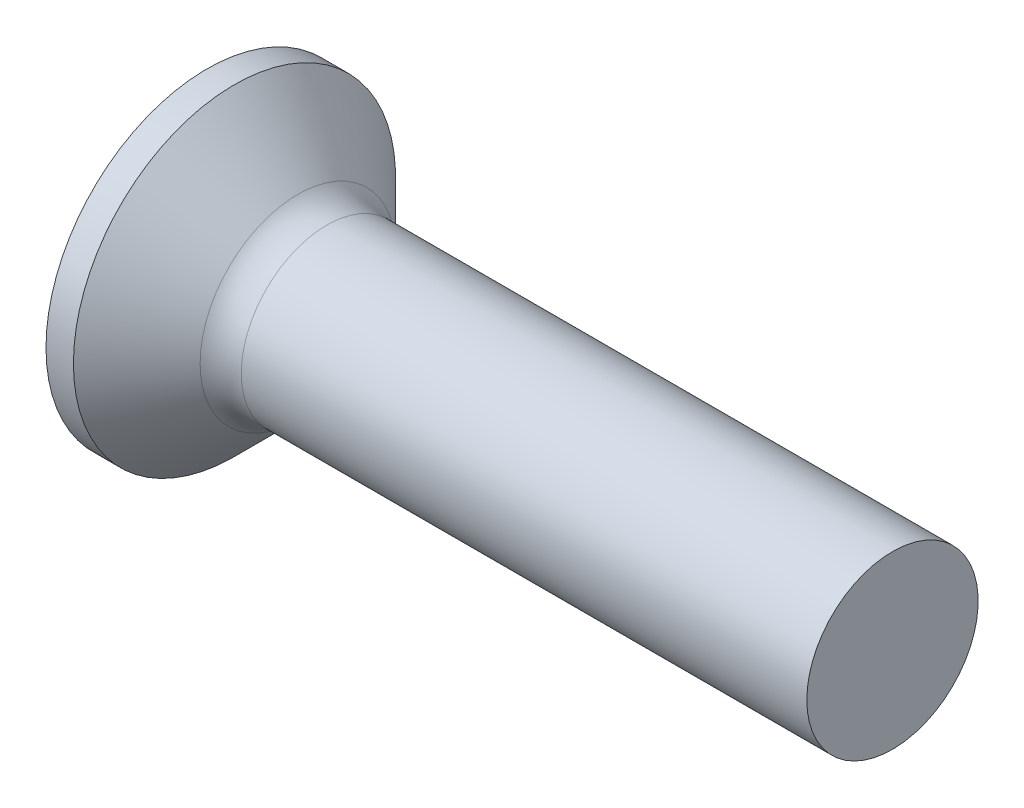
ISO-10303-21;
HEADER;
FILE_DESCRIPTION(('STEP AP214'),'2;1');
FILE_NAME('part.step','',(''),(''),'','','');
FILE_SCHEMA(('AUTOMOTIVE_DESIGN { 1 0 10303 214 1 1 1 1 }'));
ENDSEC;
DATA;
#1=APPLICATION_CONTEXT('core data for automotive mechanical design processes');
#2=APPLICATION_PROTOCOL_DEFINITION('international standard','automotive_design',2000,#1);
#3=PRODUCT_CONTEXT('',#1,'mechanical');
#4=PRODUCT('Part','Part','',(#3));
#5=PRODUCT_RELATED_PRODUCT_CATEGORY('part','',(#4));
#6=PRODUCT_DEFINITION_FORMATION('','',#4);
#7=PRODUCT_DEFINITION_CONTEXT('part definition',#1,'design');
#8=PRODUCT_DEFINITION('design','',#6,#7);
#9=PRODUCT_DEFINITION_SHAPE('','',#8);
#10=(LENGTH_UNIT() NAMED_UNIT(*) SI_UNIT(.MILLI.,.METRE.));
#11=(NAMED_UNIT(*) PLANE_ANGLE_UNIT() SI_UNIT($,.RADIAN.));
#12=(NAMED_UNIT(*) SI_UNIT($,.STERADIAN.) SOLID_ANGLE_UNIT());
#13=UNCERTAINTY_MEASURE_WITH_UNIT(LENGTH_MEASURE(1.E-05),#10,'distance_accuracy_value','');
#14=(GEOMETRIC_REPRESENTATION_CONTEXT(3) GLOBAL_UNCERTAINTY_ASSIGNED_CONTEXT((#13)) GLOBAL_UNIT_ASSIGNED_CONTEXT((#10,
#11,#12)) REPRESENTATION_CONTEXT('',''));
#15=CARTESIAN_POINT('',(0.,0.,0.));
#16=DIRECTION('',(0.,0.,1.));
#17=DIRECTION('',(1.,0.,0.));
#18=AXIS2_PLACEMENT_3D('',#15,#16,#17);
#19=CARTESIAN_POINT('',(1.73,0.370000000000002,-0.537453962312428));
#20=DIRECTION('',(-0.446197753347436,0.,0.894934391398443));
#21=DIRECTION('',(0.894934391398443,0.,0.446197753347436));
#22=AXIS2_PLACEMENT_3D('',#19,#20,#21);
#23=PLANE('',#22);
#24=DIRECTION('',(0.,1.,0.));
#25=VECTOR('',#24,1.);
#26=CARTESIAN_POINT('',(0.,0.370000000000002,-1.4));
#27=LINE('',#26,#25);
#28=CARTESIAN_POINT('',(0.,0.370000000000005,-1.4));
#29=VERTEX_POINT('',#28);
#30=CARTESIAN_POINT('',(0.,-0.369999999999995,-1.4));
#31=VERTEX_POINT('',#30);
#32=EDGE_CURVE('E175',#29,#31,#27,.F.);
#33=ORIENTED_EDGE('',*,*,#32,.T.);
#34=DIRECTION('',(-0.894934391398442,0.,-0.446197753347436));
#35=VECTOR('',#34,1.);
#36=CARTESIAN_POINT('',(1.73,-0.369999999999998,-0.53745396231243));
#37=LINE('',#36,#35);
#38=CARTESIAN_POINT('',(1.73,-0.369999999999997,-0.53745396231243));
#39=VERTEX_POINT('',#38);
#40=EDGE_CURVE('E203',#39,#31,#37,.T.);
#41=ORIENTED_EDGE('',*,*,#40,.F.);
#42=DIRECTION('',(0.,1.,0.));
#43=VECTOR('',#42,1.);
#44=CARTESIAN_POINT('',(1.73,0.370000000000002,-0.537453962312428));
#45=LINE('',#44,#43);
#46=CARTESIAN_POINT('',(1.73000000000012,-0.142405190905221,-0.53745396231243));
#47=VERTEX_POINT('',#46);
#48=EDGE_CURVE('E186',#39,#47,#45,.T.);
#49=ORIENTED_EDGE('',*,*,#48,.T.);
#50=CARTESIAN_POINT('',(2.67005399171405,0.,-0.0687604098469165));
#51=DIRECTION('',(-0.446197753347436,0.,0.894934391398443));
#52=DIRECTION('',(-0.894934391398443,0.,-0.446197753347436));
#53=AXIS2_PLACEMENT_3D('',#50,#51,#52);
#54=ELLIPSE('',#53,1.09876174310879,0.485419197280464);
#55=CARTESIAN_POINT('',(1.73000000000012,0.142405190905225,-0.537453962312429));
#56=VERTEX_POINT('',#55);
#57=EDGE_CURVE('E20',#47,#56,#54,.F.);
#58=ORIENTED_EDGE('',*,*,#57,.T.);
#59=DIRECTION('',(0.,1.,0.));
#60=VECTOR('',#59,1.);
#61=CARTESIAN_POINT('',(1.73,0.370000000000002,-0.537453962312428));
#62=LINE('',#61,#60);
#63=CARTESIAN_POINT('',(1.73,0.370000000000002,-0.537453962312428));
#64=VERTEX_POINT('',#63);
#65=EDGE_CURVE('E167',#56,#64,#62,.T.);
#66=ORIENTED_EDGE('',*,*,#65,.T.);
#67=DIRECTION('',(0.894934391398442,0.,0.446197753347436));
#68=VECTOR('',#67,1.);
#69=CARTESIAN_POINT('',(0.,0.370000000000005,-1.4));
#70=LINE('',#69,#68);
#71=EDGE_CURVE('E193',#29,#64,#70,.T.);
#72=ORIENTED_EDGE('',*,*,#71,.F.);
#73=EDGE_LOOP('',(#33,#41,#49,#58,#66,#72));
#74=FACE_BOUND('',#73,.T.);
#75=ADVANCED_FACE('F17',(#74),#23,.T.);
#76=CARTESIAN_POINT('',(1.73,-0.369999999999998,-0.53745396231243));
#77=DIRECTION('',(0.,1.,0.));
#78=DIRECTION('',(0.,0.,1.));
#79=AXIS2_PLACEMENT_3D('',#76,#77,#78);
#80=PLANE('',#79);
#81=DIRECTION('',(0.,0.,1.));
#82=VECTOR('',#81,1.);
#83=CARTESIAN_POINT('',(1.73,-0.369999999999998,-0.53745396231243));
#84=LINE('',#83,#82);
#85=CARTESIAN_POINT('',(1.73000000000467,-0.369999999999999,-0.415013252802522));
#86=VERTEX_POINT('',#85);
#87=EDGE_CURVE('E206',#86,#39,#84,.F.);
#88=ORIENTED_EDGE('',*,*,#87,.T.);
#89=ORIENTED_EDGE('',*,*,#40,.T.);
#90=DIRECTION('',(0.,0.,1.));
#91=VECTOR('',#90,1.);
#92=CARTESIAN_POINT('',(0.,-0.369999999999998,-0.53745396231243));
#93=LINE('',#92,#91);
#94=CARTESIAN_POINT('',(0.,-0.369999999999998,-0.566915305449494));
#95=VERTEX_POINT('',#94);
#96=EDGE_CURVE('E200',#31,#95,#93,.T.);
#97=ORIENTED_EDGE('',*,*,#96,.T.);
#98=CARTESIAN_POINT('',(6.21743637794065E-13,-0.369999999999998,-0.566915305449442));
#99=CARTESIAN_POINT('',(0.210211798222308,-0.369999999999998,-0.549344413477696));
#100=CARTESIAN_POINT('',(0.420407070778332,-0.369999999999998,-0.531564435264664));
#101=CARTESIAN_POINT('',(0.840738581503893,-0.369999999999998,-0.495346236705765));
#102=CARTESIAN_POINT('',(1.05087482026154,-0.369999999999998,-0.476908023170024));
#103=CARTESIAN_POINT('',(1.33915479955478,-0.369999999999998,-0.450991756825283));
#104=CARTESIAN_POINT('',(1.41733328845287,-0.369999999999999,-0.443900811028888));
#105=CARTESIAN_POINT('',(1.57367713350504,-0.369999999999999,-0.429572412876348));
#106=CARTESIAN_POINT('',(1.65184248960782,-0.369999999999999,-0.422334959960801));
#107=CARTESIAN_POINT('',(1.73000000000345,-0.369999999999999,-0.415013252805209));
#108=B_SPLINE_CURVE_WITH_KNOTS('',3,(#98,#99,#100,#101,#102,#103,#104,#105,#106,#107),
.UNSPECIFIED.,.F.,.F.,(4,2,2,2,4),(0.,0.632836027840334,1.26566551023325,1.50116361514128,
1.7366626194105),.UNSPECIFIED.);
#109=EDGE_CURVE('E446',#95,#86,#108,.T.);
#110=ORIENTED_EDGE('',*,*,#109,.T.);
#111=EDGE_LOOP('',(#88,#89,#97,#110));
#112=FACE_BOUND('',#111,.T.);
#113=ADVANCED_FACE('F464',(#112),#80,.T.);
#114=CARTESIAN_POINT('',(1.73,0.369999999999998,0.537453962312431));
#115=DIRECTION('',(0.,-1.,0.));
#116=DIRECTION('',(0.,0.,-1.));
#117=AXIS2_PLACEMENT_3D('',#114,#115,#116);
#118=PLANE('',#117);
#119=DIRECTION('',(0.,0.,-1.));
#120=VECTOR('',#119,1.);
#121=CARTESIAN_POINT('',(0.,0.369999999999998,0.537453962312431));
#122=LINE('',#121,#120);
#123=CARTESIAN_POINT('',(3.10872028908155E-13,0.370000000000002,-0.566915305449466));
#124=VERTEX_POINT('',#123);
#125=EDGE_CURVE('E196',#124,#29,#122,.T.);
#126=ORIENTED_EDGE('',*,*,#125,.T.);
#127=ORIENTED_EDGE('',*,*,#71,.T.);
#128=DIRECTION('',(0.,0.,-1.));
#129=VECTOR('',#128,1.);
#130=CARTESIAN_POINT('',(1.73,0.369999999999998,0.537453962312431));
#131=LINE('',#130,#129);
#132=CARTESIAN_POINT('',(1.73000000000456,0.370000000001036,-0.415013252804107));
#133=VERTEX_POINT('',#132);
#134=EDGE_CURVE('E171',#64,#133,#131,.F.);
#135=ORIENTED_EDGE('',*,*,#134,.T.);
#136=CARTESIAN_POINT('',(1.73000000000344,0.370000000000001,-0.415013252805134));
#137=CARTESIAN_POINT('',(1.55750312966305,0.370000000000001,-0.431158403070762));
#138=CARTESIAN_POINT('',(1.38497096483335,0.370000000000001,-0.446919624114488));
#139=CARTESIAN_POINT('',(1.039853381613,0.370000000000002,-0.477835186705177));
#140=CARTESIAN_POINT('',(0.867267963599816,0.370000000000002,-0.492989532458456));
#141=CARTESIAN_POINT('',(0.578901935102292,0.370000000000002,-0.517935214761391));
#142=CARTESIAN_POINT('',(0.463131863674144,0.370000000000002,-0.527849157298766));
#143=CARTESIAN_POINT('',(0.231576539327062,0.370000000000002,-0.547504590063611));
#144=CARTESIAN_POINT('',(0.115791286340796,0.370000000000002,-0.557246079498231));
#145=CARTESIAN_POINT('',(6.24094619879966E-13,0.370000000000002,-0.566915305449465));
#146=B_SPLINE_CURVE_WITH_KNOTS('',3,(#136,#137,#138,#139,#140,#141,#142,#143,#144,#145),
.UNSPECIFIED.,.F.,.F.,(4,2,2,2,4),(0.,0.519751041956632,1.03949848084184,1.38807974306463,
1.73666260746872),.UNSPECIFIED.);
#147=EDGE_CURVE('E443',#133,#124,#146,.T.);
#148=ORIENTED_EDGE('',*,*,#147,.T.);
#149=EDGE_LOOP('',(#126,#127,#135,#148));
#150=FACE_BOUND('',#149,.T.);
#151=ADVANCED_FACE('F487',(#150),#118,.T.);
#152=CARTESIAN_POINT('',(0.,0.,0.));
#153=DIRECTION('',(-1.,0.,0.));
#154=DIRECTION('',(0.,0.,1.));
#155=AXIS2_PLACEMENT_3D('',#152,#153,#154);
#156=CONICAL_SURFACE('',#155,0.676973384670987,0.0698131700826303);
#157=ORIENTED_EDGE('',*,*,#109,.F.);
#158=CARTESIAN_POINT('',(0.,0.,0.));
#159=DIRECTION('',(-1.,0.,0.));
#160=DIRECTION('',(0.,0.,1.));
#161=AXIS2_PLACEMENT_3D('',#158,#159,#160);
#162=CIRCLE('',#161,0.676973384670987);
#163=CARTESIAN_POINT('',(0.,-0.566915305449493,-0.37));
#164=VERTEX_POINT('',#163);
#165=EDGE_CURVE('E195',#164,#95,#162,.F.);
#166=ORIENTED_EDGE('',*,*,#165,.F.);
#167=CARTESIAN_POINT('',(1.73000000000197,-0.415013252805273,-0.37));
#168=CARTESIAN_POINT('',(1.55750312966155,-0.431158403070902,-0.37));
#169=CARTESIAN_POINT('',(1.38497096483182,-0.446919624114628,-0.37));
#170=CARTESIAN_POINT('',(1.0398533816114,-0.47783518670532,-0.37));
#171=CARTESIAN_POINT('',(0.867267963598186,-0.4929895324586,-0.37));
#172=CARTESIAN_POINT('',(0.578901935100927,-0.517935214761509,-0.37));
#173=CARTESIAN_POINT('',(0.463131863673077,-0.527849157298858,-0.37));
#174=CARTESIAN_POINT('',(0.231576539326589,-0.547504590063652,-0.37));
#175=CARTESIAN_POINT('',(0.115791286340619,-0.557246079498247,-0.37));
#176=CARTESIAN_POINT('',(7.45202362593051E-13,-0.566915305449457,-0.37));
#177=B_SPLINE_CURVE_WITH_KNOTS('',3,(#167,#168,#169,#170,#171,#172,#173,#174,#175,#176),
.UNSPECIFIED.,.F.,.F.,(4,2,2,2,4),(0.,0.519751041956728,1.03949848084203,1.38807974306393,
1.73666260746712),.UNSPECIFIED.);
#178=CARTESIAN_POINT('',(1.73000000000467,-0.415013252802521,-0.37));
#179=VERTEX_POINT('',#178);
#180=EDGE_CURVE('E433',#179,#164,#177,.T.);
#181=ORIENTED_EDGE('',*,*,#180,.F.);
#182=CARTESIAN_POINT('',(1.73000000000911,0.,0.));
#183=DIRECTION('',(-1.,0.,0.));
#184=DIRECTION('',(0.,0.,1.));
#185=AXIS2_PLACEMENT_3D('',#182,#183,#184);
#186=CIRCLE('',#185,0.55600000000311);
#187=EDGE_CURVE('E444',#86,#179,#186,.T.);
#188=ORIENTED_EDGE('',*,*,#187,.F.);
#189=EDGE_LOOP('',(#157,#166,#181,#188));
#190=FACE_BOUND('',#189,.T.);
#191=ADVANCED_FACE('F467',(#190),#156,.F.);
#192=CARTESIAN_POINT('',(0.,0.,0.));
#193=DIRECTION('',(-1.,0.,0.));
#194=DIRECTION('',(0.,0.,1.));
#195=AXIS2_PLACEMENT_3D('',#192,#193,#194);
#196=CONICAL_SURFACE('',#195,0.676973384670987,0.0698131700826303);
#197=ORIENTED_EDGE('',*,*,#147,.F.);
#198=CARTESIAN_POINT('',(1.73000000000911,0.,0.));
#199=DIRECTION('',(-1.,0.,0.));
#200=DIRECTION('',(0.,0.,1.));
#201=AXIS2_PLACEMENT_3D('',#198,#199,#200);
#202=CIRCLE('',#201,0.55600000000311);
#203=CARTESIAN_POINT('',(1.73000000000456,0.415013252804108,-0.370000000001035));
#204=VERTEX_POINT('',#203);
#205=EDGE_CURVE('E179',#204,#133,#202,.T.);
#206=ORIENTED_EDGE('',*,*,#205,.F.);
#207=CARTESIAN_POINT('',(7.42964703682483E-13,0.566915305449431,-0.37));
#208=CARTESIAN_POINT('',(0.210211798222427,0.549344413477684,-0.37));
#209=CARTESIAN_POINT('',(0.420407070778448,0.531564435264652,-0.37));
#210=CARTESIAN_POINT('',(0.840738581504004,0.495346236705754,-0.37));
#211=CARTESIAN_POINT('',(1.05087482026165,0.476908023170013,-0.37));
#212=CARTESIAN_POINT('',(1.33915479955462,0.450991756825296,-0.37));
#213=CARTESIAN_POINT('',(1.41733328845245,0.443900811028925,-0.37));
#214=CARTESIAN_POINT('',(1.5736771335041,0.429572412876434,-0.37));
#215=CARTESIAN_POINT('',(1.65184248960662,0.422334959960912,-0.37));
#216=CARTESIAN_POINT('',(1.73000000000198,0.415013252805345,-0.37));
#217=B_SPLINE_CURVE_WITH_KNOTS('',3,(#207,#208,#209,#210,#211,#212,#213,#214,#215,#216),
.UNSPECIFIED.,.F.,.F.,(4,2,2,2,4),(0.,0.632836027840326,1.26566551023323,1.50116361514048,
1.7366626194089),.UNSPECIFIED.);
#218=CARTESIAN_POINT('',(3.71481800429003E-13,0.566915305449462,-0.37));
#219=VERTEX_POINT('',#218);
#220=EDGE_CURVE('E423',#219,#204,#217,.T.);
#221=ORIENTED_EDGE('',*,*,#220,.F.);
#222=CARTESIAN_POINT('',(0.,0.,0.));
#223=DIRECTION('',(-1.,0.,0.));
#224=DIRECTION('',(0.,0.,1.));
#225=AXIS2_PLACEMENT_3D('',#222,#223,#224);
#226=CIRCLE('',#225,0.676973384670987);
#227=EDGE_CURVE('E439',#124,#219,#226,.F.);
#228=ORIENTED_EDGE('',*,*,#227,.F.);
#229=EDGE_LOOP('',(#197,#206,#221,#228));
#230=FACE_BOUND('',#229,.T.);
#231=ADVANCED_FACE('F494',(#230),#196,.F.);
#232=CARTESIAN_POINT('',(1.73,0.537453962312429,-0.37));
#233=DIRECTION('',(0.,0.,1.));
#234=DIRECTION('',(1.,0.,0.));
#235=AXIS2_PLACEMENT_3D('',#232,#233,#234);
#236=PLANE('',#235);
#237=DIRECTION('',(0.,1.,0.));
#238=VECTOR('',#237,1.);
#239=CARTESIAN_POINT('',(0.,0.537453962312429,-0.37));
#240=LINE('',#239,#238);
#241=CARTESIAN_POINT('',(0.,-1.4,-0.37));
#242=VERTEX_POINT('',#241);
#243=EDGE_CURVE('E429',#164,#242,#240,.F.);
#244=ORIENTED_EDGE('',*,*,#243,.T.);
#245=DIRECTION('',(-0.894934391398443,-0.446197753347436,0.));
#246=VECTOR('',#245,1.);
#247=CARTESIAN_POINT('',(1.73,-0.537453962312429,-0.37));
#248=LINE('',#247,#246);
#249=CARTESIAN_POINT('',(1.73,-0.537453962312429,-0.37));
#250=VERTEX_POINT('',#249);
#251=EDGE_CURVE('E410',#250,#242,#248,.T.);
#252=ORIENTED_EDGE('',*,*,#251,.F.);
#253=DIRECTION('',(0.,1.,0.));
#254=VECTOR('',#253,1.);
#255=CARTESIAN_POINT('',(1.73,0.537453962312429,-0.37));
#256=LINE('',#255,#254);
#257=EDGE_CURVE('E436',#250,#179,#256,.T.);
#258=ORIENTED_EDGE('',*,*,#257,.T.);
#259=ORIENTED_EDGE('',*,*,#180,.T.);
#260=EDGE_LOOP('',(#244,#252,#258,#259));
#261=FACE_BOUND('',#260,.T.);
#262=ADVANCED_FACE('F539',(#261),#236,.T.);
#263=CARTESIAN_POINT('',(1.73,0.537453962312429,-0.37));
#264=DIRECTION('',(0.,0.,1.));
#265=DIRECTION('',(1.,0.,0.));
#266=AXIS2_PLACEMENT_3D('',#263,#264,#265);
#267=PLANE('',#266);
#268=DIRECTION('',(0.,1.,0.));
#269=VECTOR('',#268,1.);
#270=CARTESIAN_POINT('',(1.73,0.537453962312429,-0.37));
#271=LINE('',#270,#269);
#272=CARTESIAN_POINT('',(1.73,0.53745396231243,-0.37));
#273=VERTEX_POINT('',#272);
#274=EDGE_CURVE('E415',#204,#273,#271,.T.);
#275=ORIENTED_EDGE('',*,*,#274,.T.);
#276=DIRECTION('',(0.894934391398443,-0.446197753347436,0.));
#277=VECTOR('',#276,1.);
#278=CARTESIAN_POINT('',(1.73,0.537453962312429,-0.37));
#279=LINE('',#278,#277);
#280=CARTESIAN_POINT('',(0.,1.4,-0.37));
#281=VERTEX_POINT('',#280);
#282=EDGE_CURVE('E391',#281,#273,#279,.T.);
#283=ORIENTED_EDGE('',*,*,#282,.F.);
#284=DIRECTION('',(0.,1.,0.));
#285=VECTOR('',#284,1.);
#286=CARTESIAN_POINT('',(0.,0.537453962312429,-0.37));
#287=LINE('',#286,#285);
#288=EDGE_CURVE('E426',#281,#219,#287,.F.);
#289=ORIENTED_EDGE('',*,*,#288,.T.);
#290=ORIENTED_EDGE('',*,*,#220,.T.);
#291=EDGE_LOOP('',(#275,#283,#289,#290));
#292=FACE_BOUND('',#291,.T.);
#293=ADVANCED_FACE('F534',(#292),#267,.T.);
#294=CARTESIAN_POINT('',(1.73,-0.537453962312429,-0.37));
#295=DIRECTION('',(-0.446197753347436,0.894934391398443,0.));
#296=DIRECTION('',(-0.894934391398443,-0.446197753347436,0.));
#297=AXIS2_PLACEMENT_3D('',#294,#295,#296);
#298=PLANE('',#297);
#299=DIRECTION('',(0.,0.,1.));
#300=VECTOR('',#299,1.);
#301=CARTESIAN_POINT('',(0.,-1.4,-0.37));
#302=LINE('',#301,#300);
#303=CARTESIAN_POINT('',(0.,-1.4,0.37));
#304=VERTEX_POINT('',#303);
#305=EDGE_CURVE('E401',#242,#304,#302,.T.);
#306=ORIENTED_EDGE('',*,*,#305,.T.);
#307=DIRECTION('',(-0.894934391398442,-0.446197753347436,0.));
#308=VECTOR('',#307,1.);
#309=CARTESIAN_POINT('',(1.73,-0.537453962312429,0.37));
#310=LINE('',#309,#308);
#311=CARTESIAN_POINT('',(1.73,-0.537453962312429,0.37));
#312=VERTEX_POINT('',#311);
#313=EDGE_CURVE('E351',#312,#304,#310,.T.);
#314=ORIENTED_EDGE('',*,*,#313,.F.);
#315=DIRECTION('',(0.,0.,-1.));
#316=VECTOR('',#315,1.);
#317=CARTESIAN_POINT('',(1.73,-0.537453962312429,-0.37));
#318=LINE('',#317,#316);
#319=CARTESIAN_POINT('',(1.73000000000012,-0.53745396231243,0.142405190905223));
#320=VERTEX_POINT('',#319);
#321=EDGE_CURVE('E376',#312,#320,#318,.T.);
#322=ORIENTED_EDGE('',*,*,#321,.T.);
#323=CARTESIAN_POINT('',(2.67005399171405,-0.0687604098469165,0.));
#324=DIRECTION('',(-0.446197753347436,0.894934391398443,0.));
#325=DIRECTION('',(-0.894934391398443,-0.446197753347436,0.));
#326=AXIS2_PLACEMENT_3D('',#323,#324,#325);
#327=ELLIPSE('',#326,1.09876174310879,0.485419197280464);
#328=CARTESIAN_POINT('',(1.73000000000012,-0.53745396231243,-0.142405190905223));
#329=VERTEX_POINT('',#328);
#330=EDGE_CURVE('E368',#320,#329,#327,.F.);
#331=ORIENTED_EDGE('',*,*,#330,.T.);
#332=DIRECTION('',(0.,0.,-1.));
#333=VECTOR('',#332,1.);
#334=CARTESIAN_POINT('',(1.73,-0.537453962312429,-0.37));
#335=LINE('',#334,#333);
#336=EDGE_CURVE('E361',#329,#250,#335,.T.);
#337=ORIENTED_EDGE('',*,*,#336,.T.);
#338=ORIENTED_EDGE('',*,*,#251,.T.);
#339=EDGE_LOOP('',(#306,#314,#322,#331,#337,#338));
#340=FACE_BOUND('',#339,.T.);
#341=ADVANCED_FACE('F538',(#340),#298,.T.);
#342=CARTESIAN_POINT('',(1.73,0.537453962312429,0.37));
#343=DIRECTION('',(-0.446197753347436,-0.894934391398443,0.));
#344=DIRECTION('',(0.894934391398443,-0.446197753347436,0.));
#345=AXIS2_PLACEMENT_3D('',#342,#343,#344);
#346=PLANE('',#345);
#347=DIRECTION('',(0.,0.,1.));
#348=VECTOR('',#347,1.);
#349=CARTESIAN_POINT('',(0.,1.4,0.37));
#350=LINE('',#349,#348);
#351=CARTESIAN_POINT('',(0.,1.4,0.37));
#352=VERTEX_POINT('',#351);
#353=EDGE_CURVE('E398',#352,#281,#350,.F.);
#354=ORIENTED_EDGE('',*,*,#353,.T.);
#355=ORIENTED_EDGE('',*,*,#282,.T.);
#356=DIRECTION('',(0.,0.,-1.));
#357=VECTOR('',#356,1.);
#358=CARTESIAN_POINT('',(1.73,0.53745396231243,-0.37));
#359=LINE('',#358,#357);
#360=CARTESIAN_POINT('',(1.73000000000012,0.53745396231243,-0.142405190905221));
#361=VERTEX_POINT('',#360);
#362=EDGE_CURVE('E389',#273,#361,#359,.F.);
#363=ORIENTED_EDGE('',*,*,#362,.T.);
#364=CARTESIAN_POINT('',(2.67005399171405,0.0687604098469164,0.));
#365=DIRECTION('',(-0.446197753347436,-0.894934391398443,0.));
#366=DIRECTION('',(-0.894934391398443,0.446197753347436,0.));
#367=AXIS2_PLACEMENT_3D('',#364,#365,#366);
#368=ELLIPSE('',#367,1.09876174310879,0.485419197280464);
#369=CARTESIAN_POINT('',(1.73000000000012,0.53745396231243,0.142405190905221));
#370=VERTEX_POINT('',#369);
#371=EDGE_CURVE('E382',#361,#370,#368,.F.);
#372=ORIENTED_EDGE('',*,*,#371,.T.);
#373=DIRECTION('',(0.,0.,-1.));
#374=VECTOR('',#373,1.);
#375=CARTESIAN_POINT('',(1.73,0.53745396231243,-0.37));
#376=LINE('',#375,#374);
#377=CARTESIAN_POINT('',(1.73,0.53745396231243,0.37));
#378=VERTEX_POINT('',#377);
#379=EDGE_CURVE('E378',#370,#378,#376,.F.);
#380=ORIENTED_EDGE('',*,*,#379,.T.);
#381=DIRECTION('',(0.894934391398443,-0.446197753347436,0.));
#382=VECTOR('',#381,1.);
#383=CARTESIAN_POINT('',(0.,1.4,0.37));
#384=LINE('',#383,#382);
#385=EDGE_CURVE('E181',#352,#378,#384,.T.);
#386=ORIENTED_EDGE('',*,*,#385,.F.);
#387=EDGE_LOOP('',(#354,#355,#363,#372,#380,#386));
#388=FACE_BOUND('',#387,.T.);
#389=ADVANCED_FACE('F590',(#388),#346,.T.);
#390=CARTESIAN_POINT('',(1.73,0.537453962312429,-0.37));
#391=DIRECTION('',(1.,0.,0.));
#392=DIRECTION('',(0.,0.,-1.));
#393=AXIS2_PLACEMENT_3D('',#390,#391,#392);
#394=PLANE('',#393);
#395=ORIENTED_EDGE('',*,*,#134,.F.);
#396=ORIENTED_EDGE('',*,*,#65,.F.);
#397=CARTESIAN_POINT('',(1.73000000000023,0.,0.));
#398=DIRECTION('',(-1.,0.,0.));
#399=DIRECTION('',(0.,-1.,0.));
#400=AXIS2_PLACEMENT_3D('',#397,#398,#399);
#401=CIRCLE('',#400,0.556000000000001);
#402=EDGE_CURVE('E169',#56,#133,#401,.F.);
#403=ORIENTED_EDGE('',*,*,#402,.T.);
#404=EDGE_LOOP('',(#395,#396,#403));
#405=FACE_BOUND('',#404,.T.);
#406=ADVANCED_FACE('F168',(#405),#394,.F.);
#407=CARTESIAN_POINT('',(1.73,0.537453962312429,-0.37));
#408=DIRECTION('',(1.,0.,0.));
#409=DIRECTION('',(0.,0.,-1.));
#410=AXIS2_PLACEMENT_3D('',#407,#408,#409);
#411=PLANE('',#410);
#412=ORIENTED_EDGE('',*,*,#362,.F.);
#413=ORIENTED_EDGE('',*,*,#274,.F.);
#414=CARTESIAN_POINT('',(1.73000000000023,0.,0.));
#415=DIRECTION('',(-1.,0.,0.));
#416=DIRECTION('',(0.,-1.,0.));
#417=AXIS2_PLACEMENT_3D('',#414,#415,#416);
#418=CIRCLE('',#417,0.556000000000001);
#419=EDGE_CURVE('E180',#204,#361,#418,.F.);
#420=ORIENTED_EDGE('',*,*,#419,.T.);
#421=EDGE_LOOP('',(#412,#413,#420));
#422=FACE_BOUND('',#421,.T.);
#423=ADVANCED_FACE('F584',(#422),#411,.F.);
#424=CARTESIAN_POINT('',(1.68695256780893,0.,0.));
#425=DIRECTION('',(-1.,0.,0.));
#426=DIRECTION('',(0.,0.,1.));
#427=AXIS2_PLACEMENT_3D('',#424,#425,#426);
#428=CONICAL_SURFACE('',#427,0.55901016970239,0.0698131701529839);
#429=ORIENTED_EDGE('',*,*,#371,.F.);
#430=CARTESIAN_POINT('',(1.73000000000023,0.,0.));
#431=DIRECTION('',(-1.,0.,0.));
#432=DIRECTION('',(0.,0.,1.));
#433=AXIS2_PLACEMENT_3D('',#430,#431,#432);
#434=CIRCLE('',#433,0.556000000000001);
#435=EDGE_CURVE('E385',#361,#370,#434,.F.);
#436=ORIENTED_EDGE('',*,*,#435,.T.);
#437=EDGE_LOOP('',(#429,#436));
#438=FACE_BOUND('',#437,.T.);
#439=ADVANCED_FACE('F580',(#438),#428,.F.);
#440=CARTESIAN_POINT('',(1.73,0.537453962312429,-0.37));
#441=DIRECTION('',(1.,0.,0.));
#442=DIRECTION('',(0.,0.,-1.));
#443=AXIS2_PLACEMENT_3D('',#440,#441,#442);
#444=PLANE('',#443);
#445=DIRECTION('',(0.,1.,0.));
#446=VECTOR('',#445,1.);
#447=CARTESIAN_POINT('',(1.73,-0.537453962312429,0.37));
#448=LINE('',#447,#446);
#449=CARTESIAN_POINT('',(1.73000000000467,0.415013252802521,0.370000000000001));
#450=VERTEX_POINT('',#449);
#451=EDGE_CURVE('E346',#378,#450,#448,.F.);
#452=ORIENTED_EDGE('',*,*,#451,.F.);
#453=ORIENTED_EDGE('',*,*,#379,.F.);
#454=CARTESIAN_POINT('',(1.73000000000023,0.,0.));
#455=DIRECTION('',(-1.,0.,0.));
#456=DIRECTION('',(0.,-1.,0.));
#457=AXIS2_PLACEMENT_3D('',#454,#455,#456);
#458=CIRCLE('',#457,0.556000000000001);
#459=EDGE_CURVE('E388',#370,#450,#458,.F.);
#460=ORIENTED_EDGE('',*,*,#459,.T.);
#461=EDGE_LOOP('',(#452,#453,#460));
#462=FACE_BOUND('',#461,.T.);
#463=ADVANCED_FACE('F573',(#462),#444,.F.);
#464=CARTESIAN_POINT('',(1.73,0.537453962312429,-0.37));
#465=DIRECTION('',(1.,0.,0.));
#466=DIRECTION('',(0.,0.,-1.));
#467=AXIS2_PLACEMENT_3D('',#464,#465,#466);
#468=PLANE('',#467);
#469=ORIENTED_EDGE('',*,*,#321,.F.);
#470=DIRECTION('',(0.,1.,0.));
#471=VECTOR('',#470,1.);
#472=CARTESIAN_POINT('',(1.73,-0.537453962312429,0.37));
#473=LINE('',#472,#471);
#474=CARTESIAN_POINT('',(1.73000000000467,-0.415013252802521,0.370000000000001));
#475=VERTEX_POINT('',#474);
#476=EDGE_CURVE('E354',#475,#312,#473,.F.);
#477=ORIENTED_EDGE('',*,*,#476,.F.);
#478=CARTESIAN_POINT('',(1.73000000000023,0.,0.));
#479=DIRECTION('',(-1.,0.,0.));
#480=DIRECTION('',(0.,-1.,0.));
#481=AXIS2_PLACEMENT_3D('',#478,#479,#480);
#482=CIRCLE('',#481,0.556000000000001);
#483=EDGE_CURVE('E375',#475,#320,#482,.F.);
#484=ORIENTED_EDGE('',*,*,#483,.T.);
#485=EDGE_LOOP('',(#469,#477,#484));
#486=FACE_BOUND('',#485,.T.);
#487=ADVANCED_FACE('F566',(#486),#468,.F.);
#488=CARTESIAN_POINT('',(1.68695256780893,0.,0.));
#489=DIRECTION('',(-1.,0.,0.));
#490=DIRECTION('',(0.,0.,1.));
#491=AXIS2_PLACEMENT_3D('',#488,#489,#490);
#492=CONICAL_SURFACE('',#491,0.55901016970239,0.0698131701529839);
#493=ORIENTED_EDGE('',*,*,#330,.F.);
#494=CARTESIAN_POINT('',(1.73000000000023,0.,0.));
#495=DIRECTION('',(-1.,0.,0.));
#496=DIRECTION('',(0.,0.,1.));
#497=AXIS2_PLACEMENT_3D('',#494,#495,#496);
#498=CIRCLE('',#497,0.556000000000001);
#499=EDGE_CURVE('E371',#320,#329,#498,.F.);
#500=ORIENTED_EDGE('',*,*,#499,.T.);
#501=EDGE_LOOP('',(#493,#500));
#502=FACE_BOUND('',#501,.T.);
#503=ADVANCED_FACE('F564',(#502),#492,.F.);
#504=CARTESIAN_POINT('',(1.73,0.537453962312429,-0.37));
#505=DIRECTION('',(1.,0.,0.));
#506=DIRECTION('',(0.,0.,-1.));
#507=AXIS2_PLACEMENT_3D('',#504,#505,#506);
#508=PLANE('',#507);
#509=ORIENTED_EDGE('',*,*,#257,.F.);
#510=ORIENTED_EDGE('',*,*,#336,.F.);
#511=CARTESIAN_POINT('',(1.73000000000023,0.,0.));
#512=DIRECTION('',(-1.,0.,0.));
#513=DIRECTION('',(0.,-1.,0.));
#514=AXIS2_PLACEMENT_3D('',#511,#512,#513);
#515=CIRCLE('',#514,0.556000000000001);
#516=EDGE_CURVE('E374',#329,#179,#515,.F.);
#517=ORIENTED_EDGE('',*,*,#516,.T.);
#518=EDGE_LOOP('',(#509,#510,#517));
#519=FACE_BOUND('',#518,.T.);
#520=ADVANCED_FACE('F559',(#519),#508,.F.);
#521=CARTESIAN_POINT('',(1.73,0.537453962312429,-0.37));
#522=DIRECTION('',(1.,0.,0.));
#523=DIRECTION('',(0.,0.,-1.));
#524=AXIS2_PLACEMENT_3D('',#521,#522,#523);
#525=PLANE('',#524);
#526=ORIENTED_EDGE('',*,*,#48,.F.);
#527=ORIENTED_EDGE('',*,*,#87,.F.);
#528=CARTESIAN_POINT('',(1.73000000000023,0.,0.));
#529=DIRECTION('',(-1.,0.,0.));
#530=DIRECTION('',(0.,-1.,0.));
#531=AXIS2_PLACEMENT_3D('',#528,#529,#530);
#532=CIRCLE('',#531,0.556000000000001);
#533=EDGE_CURVE('E162',#86,#47,#532,.F.);
#534=ORIENTED_EDGE('',*,*,#533,.T.);
#535=EDGE_LOOP('',(#526,#527,#534));
#536=FACE_BOUND('',#535,.T.);
#537=ADVANCED_FACE('F502',(#536),#525,.F.);
#538=CARTESIAN_POINT('',(1.68695256780893,0.,0.));
#539=DIRECTION('',(-1.,0.,0.));
#540=DIRECTION('',(0.,0.,1.));
#541=AXIS2_PLACEMENT_3D('',#538,#539,#540);
#542=CONICAL_SURFACE('',#541,0.55901016970239,0.0698131701529839);
#543=ORIENTED_EDGE('',*,*,#57,.F.);
#544=CARTESIAN_POINT('',(1.73000000000023,0.,0.));
#545=DIRECTION('',(-1.,0.,0.));
#546=DIRECTION('',(0.,0.,1.));
#547=AXIS2_PLACEMENT_3D('',#544,#545,#546);
#548=CIRCLE('',#547,0.556000000000001);
#549=EDGE_CURVE('E154',#47,#56,#548,.F.);
#550=ORIENTED_EDGE('',*,*,#549,.T.);
#551=EDGE_LOOP('',(#543,#550));
#552=FACE_BOUND('',#551,.T.);
#553=ADVANCED_FACE('F156',(#552),#542,.F.);
#554=CARTESIAN_POINT('',(1.73,-0.537453962312429,0.37));
#555=DIRECTION('',(0.,0.,-1.));
#556=DIRECTION('',(0.,1.,0.));
#557=AXIS2_PLACEMENT_3D('',#554,#555,#556);
#558=PLANE('',#557);
#559=ORIENTED_EDGE('',*,*,#476,.T.);
#560=ORIENTED_EDGE('',*,*,#313,.T.);
#561=DIRECTION('',(0.,1.,0.));
#562=VECTOR('',#561,1.);
#563=CARTESIAN_POINT('',(0.,-0.537453962312429,0.37));
#564=LINE('',#563,#562);
#565=CARTESIAN_POINT('',(0.,-0.566915305449493,0.37));
#566=VERTEX_POINT('',#565);
#567=EDGE_CURVE('E357',#304,#566,#564,.T.);
#568=ORIENTED_EDGE('',*,*,#567,.T.);
#569=CARTESIAN_POINT('',(6.21752740174334E-13,-0.566915305449441,0.37));
#570=CARTESIAN_POINT('',(0.210211798222309,-0.549344413477694,0.37));
#571=CARTESIAN_POINT('',(0.420407070778332,-0.531564435264662,0.37));
#572=CARTESIAN_POINT('',(0.840738581503893,-0.495346236705764,0.37));
#573=CARTESIAN_POINT('',(1.05087482026154,-0.476908023170023,0.37));
#574=CARTESIAN_POINT('',(1.33915479955478,-0.450991756825281,0.37));
#575=CARTESIAN_POINT('',(1.41733328845287,-0.443900811028887,0.37));
#576=CARTESIAN_POINT('',(1.57367713350504,-0.429572412876347,0.37));
#577=CARTESIAN_POINT('',(1.65184248960782,-0.4223349599608,0.37));
#578=CARTESIAN_POINT('',(1.73000000000345,-0.415013252805207,0.37));
#579=B_SPLINE_CURVE_WITH_KNOTS('',3,(#569,#570,#571,#572,#573,#574,#575,#576,#577,#578),
.UNSPECIFIED.,.F.,.F.,(4,2,2,2,4),(0.,0.632836027840334,1.26566551023325,1.50116361514128,
1.7366626194105),.UNSPECIFIED.);
#580=EDGE_CURVE('E161',#566,#475,#579,.T.);
#581=ORIENTED_EDGE('',*,*,#580,.T.);
#582=EDGE_LOOP('',(#559,#560,#568,#581));
#583=FACE_BOUND('',#582,.T.);
#584=ADVANCED_FACE('F624',(#583),#558,.T.);
#585=CARTESIAN_POINT('',(1.73,-0.537453962312429,0.37));
#586=DIRECTION('',(0.,0.,-1.));
#587=DIRECTION('',(0.,1.,0.));
#588=AXIS2_PLACEMENT_3D('',#585,#586,#587);
#589=PLANE('',#588);
#590=DIRECTION('',(0.,1.,0.));
#591=VECTOR('',#590,1.);
#592=CARTESIAN_POINT('',(0.,-0.537453962312429,0.37));
#593=LINE('',#592,#591);
#594=CARTESIAN_POINT('',(3.10879959610252E-13,0.566915305449467,0.37));
#595=VERTEX_POINT('',#594);
#596=EDGE_CURVE('E343',#595,#352,#593,.T.);
#597=ORIENTED_EDGE('',*,*,#596,.T.);
#598=ORIENTED_EDGE('',*,*,#385,.T.);
#599=ORIENTED_EDGE('',*,*,#451,.T.);
#600=CARTESIAN_POINT('',(1.73000000000344,0.415013252805135,0.37));
#601=CARTESIAN_POINT('',(1.55750312966305,0.431158403070764,0.37));
#602=CARTESIAN_POINT('',(1.38497096483335,0.446919624114489,0.37));
#603=CARTESIAN_POINT('',(1.039853381613,0.477835186705178,0.37));
#604=CARTESIAN_POINT('',(0.867267963599816,0.492989532458458,0.37));
#605=CARTESIAN_POINT('',(0.578901935102292,0.517935214761392,0.37));
#606=CARTESIAN_POINT('',(0.463131863674144,0.527849157298767,0.37));
#607=CARTESIAN_POINT('',(0.231576539327063,0.547504590063612,0.37));
#608=CARTESIAN_POINT('',(0.115791286340796,0.557246079498232,0.37));
#609=CARTESIAN_POINT('',(6.2410760247968E-13,0.566915305449467,0.37));
#610=B_SPLINE_CURVE_WITH_KNOTS('',3,(#600,#601,#602,#603,#604,#605,#606,#607,#608,#609),
.UNSPECIFIED.,.F.,.F.,(4,2,2,2,4),(0.,0.519751041956632,1.03949848084184,1.38807974306463,
1.73666260746872),.UNSPECIFIED.);
#611=EDGE_CURVE('E609',#450,#595,#610,.T.);
#612=ORIENTED_EDGE('',*,*,#611,.T.);
#613=EDGE_LOOP('',(#597,#598,#599,#612));
#614=FACE_BOUND('',#613,.T.);
#615=ADVANCED_FACE('F607',(#614),#589,.T.);
#616=CARTESIAN_POINT('',(1.73000000000023,0.,0.));
#617=DIRECTION('',(-1.,0.,0.));
#618=DIRECTION('',(0.,-1.,0.));
#619=AXIS2_PLACEMENT_3D('',#616,#617,#618);
#620=CONICAL_SURFACE('',#619,0.556000000000001,1.25663706143516);
#621=CARTESIAN_POINT('',(1.91065535110579,0.,2.22044604925031E-13));
#622=VERTEX_POINT('',#621);
#623=VERTEX_LOOP('',#622);
#624=FACE_BOUND('',#623,.T.);
#625=ORIENTED_EDGE('',*,*,#402,.F.);
#626=ORIENTED_EDGE('',*,*,#549,.F.);
#627=ORIENTED_EDGE('',*,*,#533,.F.);
#628=ORIENTED_EDGE('',*,*,#187,.T.);
#629=ORIENTED_EDGE('',*,*,#516,.F.);
#630=ORIENTED_EDGE('',*,*,#499,.F.);
#631=ORIENTED_EDGE('',*,*,#483,.F.);
#632=CARTESIAN_POINT('',(1.73000000000911,0.,0.));
#633=DIRECTION('',(-1.,0.,0.));
#634=DIRECTION('',(0.,0.,1.));
#635=AXIS2_PLACEMENT_3D('',#632,#633,#634);
#636=CIRCLE('',#635,0.55600000000311);
#637=CARTESIAN_POINT('',(1.73000000000467,-0.370000000000001,0.41501325280252));
#638=VERTEX_POINT('',#637);
#639=EDGE_CURVE('E340',#475,#638,#636,.T.);
#640=ORIENTED_EDGE('',*,*,#639,.T.);
#641=CARTESIAN_POINT('',(1.73000000000023,0.,0.));
#642=DIRECTION('',(-1.,0.,0.));
#643=DIRECTION('',(0.,-1.,0.));
#644=AXIS2_PLACEMENT_3D('',#641,#642,#643);
#645=CIRCLE('',#644,0.556000000000001);
#646=CARTESIAN_POINT('',(1.73000000000467,-0.142405190912552,0.537453962310158));
#647=VERTEX_POINT('',#646);
#648=EDGE_CURVE('E316',#638,#647,#645,.T.);
#649=ORIENTED_EDGE('',*,*,#648,.T.);
#650=CARTESIAN_POINT('',(1.73000000000911,0.,0.));
#651=DIRECTION('',(-1.,0.,0.));
#652=DIRECTION('',(0.,0.,1.));
#653=AXIS2_PLACEMENT_3D('',#650,#651,#652);
#654=CIRCLE('',#653,0.55600000000311);
#655=CARTESIAN_POINT('',(1.73000000000467,0.142405190912551,0.537453962310159));
#656=VERTEX_POINT('',#655);
#657=EDGE_CURVE('E324',#647,#656,#654,.T.);
#658=ORIENTED_EDGE('',*,*,#657,.T.);
#659=CARTESIAN_POINT('',(1.73000000000023,0.,0.));
#660=DIRECTION('',(-1.,0.,0.));
#661=DIRECTION('',(0.,-1.,0.));
#662=AXIS2_PLACEMENT_3D('',#659,#660,#661);
#663=CIRCLE('',#662,0.556000000000001);
#664=CARTESIAN_POINT('',(1.73000000000467,0.369999999999999,0.415013252802522));
#665=VERTEX_POINT('',#664);
#666=EDGE_CURVE('E326',#656,#665,#663,.T.);
#667=ORIENTED_EDGE('',*,*,#666,.T.);
#668=CARTESIAN_POINT('',(1.73000000000911,0.,0.));
#669=DIRECTION('',(-1.,0.,0.));
#670=DIRECTION('',(0.,0.,1.));
#671=AXIS2_PLACEMENT_3D('',#668,#669,#670);
#672=CIRCLE('',#671,0.55600000000311);
#673=EDGE_CURVE('E333',#665,#450,#672,.T.);
#674=ORIENTED_EDGE('',*,*,#673,.T.);
#675=ORIENTED_EDGE('',*,*,#459,.F.);
#676=ORIENTED_EDGE('',*,*,#435,.F.);
#677=ORIENTED_EDGE('',*,*,#419,.F.);
#678=ORIENTED_EDGE('',*,*,#205,.T.);
#679=EDGE_LOOP('',(#625,#626,#627,#628,#629,#630,#631,#640,#649,#658,#667,#674,#675,#676,#677,#678));
#680=FACE_BOUND('',#679,.T.);
#681=ADVANCED_FACE('F177',(#624,#680),#620,.F.);
#682=CARTESIAN_POINT('',(0.,0.,0.));
#683=DIRECTION('',(-1.,0.,0.));
#684=DIRECTION('',(0.,0.,1.));
#685=AXIS2_PLACEMENT_3D('',#682,#683,#684);
#686=CONICAL_SURFACE('',#685,0.676973384670987,0.0698131700826303);
#687=CARTESIAN_POINT('',(1.73000000000197,-0.370000000000001,0.415013252805271));
#688=CARTESIAN_POINT('',(1.55750312966155,-0.370000000000001,0.431158403070901));
#689=CARTESIAN_POINT('',(1.38497096483182,-0.370000000000001,0.446919624114627));
#690=CARTESIAN_POINT('',(1.0398533816114,-0.370000000000002,0.477835186705318));
#691=CARTESIAN_POINT('',(0.867267963598185,-0.370000000000002,0.492989532458599));
#692=CARTESIAN_POINT('',(0.578901935100927,-0.370000000000002,0.517935214761508));
#693=CARTESIAN_POINT('',(0.463131863673076,-0.370000000000002,0.527849157298857));
#694=CARTESIAN_POINT('',(0.231576539326589,-0.370000000000002,0.547504590063651));
#695=CARTESIAN_POINT('',(0.115791286340619,-0.370000000000002,0.557246079498246));
#696=CARTESIAN_POINT('',(7.45095367346273E-13,-0.370000000000002,0.566915305449455));
#697=B_SPLINE_CURVE_WITH_KNOTS('',3,(#687,#688,#689,#690,#691,#692,#693,#694,#695,#696),
.UNSPECIFIED.,.F.,.F.,(4,2,2,2,4),(0.,0.519751041956728,1.03949848084203,1.38807974306393,
1.73666260746712),.UNSPECIFIED.);
#698=CARTESIAN_POINT('',(0.,-0.370000000000002,0.566915305449492));
#699=VERTEX_POINT('',#698);
#700=EDGE_CURVE('E232',#638,#699,#697,.T.);
#701=ORIENTED_EDGE('',*,*,#700,.F.);
#702=ORIENTED_EDGE('',*,*,#639,.F.);
#703=ORIENTED_EDGE('',*,*,#580,.F.);
#704=CARTESIAN_POINT('',(0.,0.,0.));
#705=DIRECTION('',(-1.,0.,0.));
#706=DIRECTION('',(0.,0.,1.));
#707=AXIS2_PLACEMENT_3D('',#704,#705,#706);
#708=CIRCLE('',#707,0.676973384670987);
#709=EDGE_CURVE('E342',#699,#566,#708,.F.);
#710=ORIENTED_EDGE('',*,*,#709,.F.);
#711=EDGE_LOOP('',(#701,#702,#703,#710));
#712=FACE_BOUND('',#711,.T.);
#713=ADVANCED_FACE('F269',(#712),#686,.F.);
#714=CARTESIAN_POINT('',(0.,0.,0.));
#715=DIRECTION('',(-1.,0.,0.));
#716=DIRECTION('',(0.,0.,1.));
#717=AXIS2_PLACEMENT_3D('',#714,#715,#716);
#718=CONICAL_SURFACE('',#717,0.676973384670987,0.0698131700826303);
#719=CARTESIAN_POINT('',(7.42964402961748E-13,0.369999999999998,0.566915305449432));
#720=CARTESIAN_POINT('',(0.210211798222426,0.369999999999998,0.549344413477686));
#721=CARTESIAN_POINT('',(0.420407070778448,0.369999999999998,0.531564435264654));
#722=CARTESIAN_POINT('',(0.840738581504004,0.369999999999998,0.495346236705755));
#723=CARTESIAN_POINT('',(1.05087482026165,0.369999999999998,0.476908023170015));
#724=CARTESIAN_POINT('',(1.33915479955462,0.369999999999998,0.450991756825297));
#725=CARTESIAN_POINT('',(1.41733328845245,0.369999999999998,0.443900811028926));
#726=CARTESIAN_POINT('',(1.5736771335041,0.369999999999998,0.429572412876435));
#727=CARTESIAN_POINT('',(1.65184248960662,0.369999999999998,0.422334959960913));
#728=CARTESIAN_POINT('',(1.73000000000198,0.369999999999999,0.415013252805346));
#729=B_SPLINE_CURVE_WITH_KNOTS('',3,(#719,#720,#721,#722,#723,#724,#725,#726,#727,#728),
.UNSPECIFIED.,.F.,.F.,(4,2,2,2,4),(0.,0.632836027840327,1.26566551023323,1.50116361514048,
1.7366626194089),.UNSPECIFIED.);
#730=CARTESIAN_POINT('',(3.71481650068636E-13,0.369999999999998,0.566915305449463));
#731=VERTEX_POINT('',#730);
#732=EDGE_CURVE('E222',#731,#665,#729,.T.);
#733=ORIENTED_EDGE('',*,*,#732,.F.);
#734=CARTESIAN_POINT('',(0.,0.,0.));
#735=DIRECTION('',(-1.,0.,0.));
#736=DIRECTION('',(0.,0.,1.));
#737=AXIS2_PLACEMENT_3D('',#734,#735,#736);
#738=CIRCLE('',#737,0.676973384670987);
#739=EDGE_CURVE('E336',#595,#731,#738,.F.);
#740=ORIENTED_EDGE('',*,*,#739,.F.);
#741=ORIENTED_EDGE('',*,*,#611,.F.);
#742=ORIENTED_EDGE('',*,*,#673,.F.);
#743=EDGE_LOOP('',(#733,#740,#741,#742));
#744=FACE_BOUND('',#743,.T.);
#745=ADVANCED_FACE('F240',(#744),#718,.F.);
#746=CARTESIAN_POINT('',(1.73,0.537453962312429,-0.37));
#747=DIRECTION('',(1.,0.,0.));
#748=DIRECTION('',(0.,0.,-1.));
#749=AXIS2_PLACEMENT_3D('',#746,#747,#748);
#750=PLANE('',#749);
#751=DIRECTION('',(0.,1.,0.));
#752=VECTOR('',#751,1.);
#753=CARTESIAN_POINT('',(1.73,-0.370000000000002,0.537453962312429));
#754=LINE('',#753,#752);
#755=CARTESIAN_POINT('',(1.73,0.369999999999996,0.537453962312431));
#756=VERTEX_POINT('',#755);
#757=EDGE_CURVE('E221',#756,#656,#754,.F.);
#758=ORIENTED_EDGE('',*,*,#757,.F.);
#759=DIRECTION('',(0.,0.,-1.));
#760=VECTOR('',#759,1.);
#761=CARTESIAN_POINT('',(1.73,0.369999999999998,0.537453962312431));
#762=LINE('',#761,#760);
#763=EDGE_CURVE('E231',#665,#756,#762,.F.);
#764=ORIENTED_EDGE('',*,*,#763,.F.);
#765=ORIENTED_EDGE('',*,*,#666,.F.);
#766=EDGE_LOOP('',(#758,#764,#765));
#767=FACE_BOUND('',#766,.T.);
#768=ADVANCED_FACE('F261',(#767),#750,.F.);
#769=CARTESIAN_POINT('',(1.68647472582961,0.,0.));
#770=DIRECTION('',(-1.,0.,0.));
#771=DIRECTION('',(0.,0.,1.));
#772=AXIS2_PLACEMENT_3D('',#769,#770,#771);
#773=CONICAL_SURFACE('',#772,0.559043583670871,0.0698131702037254);
#774=ORIENTED_EDGE('',*,*,#657,.F.);
#775=CARTESIAN_POINT('',(2.67005399162522,0.,0.068760409891204));
#776=DIRECTION('',(-0.446197753347436,0.,-0.894934391398443));
#777=DIRECTION('',(-0.894934391398443,0.,0.446197753347436));
#778=AXIS2_PLACEMENT_3D('',#775,#776,#777);
#779=ELLIPSE('',#778,1.09876174301528,0.485419197232053);
#780=EDGE_CURVE('E217',#656,#647,#779,.F.);
#781=ORIENTED_EDGE('',*,*,#780,.F.);
#782=EDGE_LOOP('',(#774,#781));
#783=FACE_BOUND('',#782,.T.);
#784=ADVANCED_FACE('F258',(#783),#773,.F.);
#785=CARTESIAN_POINT('',(1.73,0.537453962312429,-0.37));
#786=DIRECTION('',(1.,0.,0.));
#787=DIRECTION('',(0.,0.,-1.));
#788=AXIS2_PLACEMENT_3D('',#785,#786,#787);
#789=PLANE('',#788);
#790=DIRECTION('',(0.,0.,1.));
#791=VECTOR('',#790,1.);
#792=CARTESIAN_POINT('',(1.73,-0.369999999999998,-0.53745396231243));
#793=LINE('',#792,#791);
#794=CARTESIAN_POINT('',(1.73,-0.370000000000002,0.537453962312428));
#795=VERTEX_POINT('',#794);
#796=EDGE_CURVE('E313',#795,#638,#793,.F.);
#797=ORIENTED_EDGE('',*,*,#796,.F.);
#798=DIRECTION('',(0.,1.,0.));
#799=VECTOR('',#798,1.);
#800=CARTESIAN_POINT('',(1.73,-0.370000000000002,0.537453962312428));
#801=LINE('',#800,#799);
#802=EDGE_CURVE('E220',#647,#795,#801,.F.);
#803=ORIENTED_EDGE('',*,*,#802,.F.);
#804=ORIENTED_EDGE('',*,*,#648,.F.);
#805=EDGE_LOOP('',(#797,#803,#804));
#806=FACE_BOUND('',#805,.T.);
#807=ADVANCED_FACE('F254',(#806),#789,.F.);
#808=CARTESIAN_POINT('',(1.73,-0.369999999999998,-0.53745396231243));
#809=DIRECTION('',(0.,1.,0.));
#810=DIRECTION('',(0.,0.,1.));
#811=AXIS2_PLACEMENT_3D('',#808,#809,#810);
#812=PLANE('',#811);
#813=DIRECTION('',(0.,0.,1.));
#814=VECTOR('',#813,1.);
#815=CARTESIAN_POINT('',(0.,-0.369999999999998,-0.53745396231243));
#816=LINE('',#815,#814);
#817=CARTESIAN_POINT('',(0.,-0.370000000000004,1.4));
#818=VERTEX_POINT('',#817);
#819=EDGE_CURVE('E307',#699,#818,#816,.T.);
#820=ORIENTED_EDGE('',*,*,#819,.T.);
#821=DIRECTION('',(-0.894934391398443,0.,0.446197753347436));
#822=VECTOR('',#821,1.);
#823=CARTESIAN_POINT('',(1.73,-0.370000000000002,0.537453962312428));
#824=LINE('',#823,#822);
#825=EDGE_CURVE('E295',#795,#818,#824,.T.);
#826=ORIENTED_EDGE('',*,*,#825,.F.);
#827=ORIENTED_EDGE('',*,*,#796,.T.);
#828=ORIENTED_EDGE('',*,*,#700,.T.);
#829=EDGE_LOOP('',(#820,#826,#827,#828));
#830=FACE_BOUND('',#829,.T.);
#831=ADVANCED_FACE('F248',(#830),#812,.T.);
#832=CARTESIAN_POINT('',(1.73,0.369999999999998,0.537453962312431));
#833=DIRECTION('',(0.,-1.,0.));
#834=DIRECTION('',(0.,0.,-1.));
#835=AXIS2_PLACEMENT_3D('',#832,#833,#834);
#836=PLANE('',#835);
#837=ORIENTED_EDGE('',*,*,#763,.T.);
#838=DIRECTION('',(-0.894934391398443,0.,0.446197753347436));
#839=VECTOR('',#838,1.);
#840=CARTESIAN_POINT('',(1.73,0.369999999999995,0.53745396231243));
#841=LINE('',#840,#839);
#842=CARTESIAN_POINT('',(0.,0.369999999999995,1.4));
#843=VERTEX_POINT('',#842);
#844=EDGE_CURVE('E321',#843,#756,#841,.F.);
#845=ORIENTED_EDGE('',*,*,#844,.F.);
#846=DIRECTION('',(0.,0.,-1.));
#847=VECTOR('',#846,1.);
#848=CARTESIAN_POINT('',(0.,0.369999999999998,0.537453962312431));
#849=LINE('',#848,#847);
#850=EDGE_CURVE('E35',#843,#731,#849,.T.);
#851=ORIENTED_EDGE('',*,*,#850,.T.);
#852=ORIENTED_EDGE('',*,*,#732,.T.);
#853=EDGE_LOOP('',(#837,#845,#851,#852));
#854=FACE_BOUND('',#853,.T.);
#855=ADVANCED_FACE('F243',(#854),#836,.T.);
#856=CARTESIAN_POINT('',(1.73,-0.370000000000002,0.537453962312428));
#857=DIRECTION('',(-0.446197753347436,0.,-0.894934391398443));
#858=DIRECTION('',(-0.894934391398443,0.,0.446197753347436));
#859=AXIS2_PLACEMENT_3D('',#856,#857,#858);
#860=PLANE('',#859);
#861=DIRECTION('',(0.,1.,0.));
#862=VECTOR('',#861,1.);
#863=CARTESIAN_POINT('',(0.,0.,1.4));
#864=LINE('',#863,#862);
#865=EDGE_CURVE('E216',#843,#818,#864,.F.);
#866=ORIENTED_EDGE('',*,*,#865,.F.);
#867=ORIENTED_EDGE('',*,*,#844,.T.);
#868=ORIENTED_EDGE('',*,*,#757,.T.);
#869=ORIENTED_EDGE('',*,*,#780,.T.);
#870=ORIENTED_EDGE('',*,*,#802,.T.);
#871=ORIENTED_EDGE('',*,*,#825,.T.);
#872=EDGE_LOOP('',(#866,#867,#868,#869,#870,#871));
#873=FACE_BOUND('',#872,.T.);
#874=ADVANCED_FACE('F247',(#873),#860,.T.);
#875=CARTESIAN_POINT('',(0.,0.,0.));
#876=DIRECTION('',(-1.,0.,0.));
#877=DIRECTION('',(0.,0.,1.));
#878=AXIS2_PLACEMENT_3D('',#875,#876,#877);
#879=PLANE('',#878);
#880=ORIENTED_EDGE('',*,*,#850,.F.);
#881=ORIENTED_EDGE('',*,*,#865,.T.);
#882=ORIENTED_EDGE('',*,*,#819,.F.);
#883=ORIENTED_EDGE('',*,*,#709,.T.);
#884=ORIENTED_EDGE('',*,*,#567,.F.);
#885=ORIENTED_EDGE('',*,*,#305,.F.);
#886=ORIENTED_EDGE('',*,*,#243,.F.);
#887=ORIENTED_EDGE('',*,*,#165,.T.);
#888=ORIENTED_EDGE('',*,*,#96,.F.);
#889=ORIENTED_EDGE('',*,*,#32,.F.);
#890=ORIENTED_EDGE('',*,*,#125,.F.);
#891=ORIENTED_EDGE('',*,*,#227,.T.);
#892=ORIENTED_EDGE('',*,*,#288,.F.);
#893=ORIENTED_EDGE('',*,*,#353,.F.);
#894=ORIENTED_EDGE('',*,*,#596,.F.);
#895=ORIENTED_EDGE('',*,*,#739,.T.);
#896=EDGE_LOOP('',(#880,#881,#882,#883,#884,#885,#886,#887,#888,#889,#890,#891,#892,#893,#894,#895));
#897=FACE_BOUND('',#896,.T.);
#898=CARTESIAN_POINT('',(0.,0.,0.));
#899=DIRECTION('',(-1.,0.,0.));
#900=DIRECTION('',(0.,0.,1.));
#901=AXIS2_PLACEMENT_3D('',#898,#899,#900);
#902=CIRCLE('',#901,2.35);
#903=CARTESIAN_POINT('',(0.,0.,2.35));
#904=VERTEX_POINT('',#903);
#905=EDGE_CURVE('E212',#904,#904,#902,.F.);
#906=ORIENTED_EDGE('',*,*,#905,.F.);
#907=EDGE_LOOP('',(#906));
#908=FACE_BOUND('',#907,.T.);
#909=ADVANCED_FACE('F498',(#897,#908),#879,.T.);
#910=CARTESIAN_POINT('',(-6.34999999999999,0.,0.));
#911=DIRECTION('',(-1.,0.,0.));
#912=DIRECTION('',(0.,0.,1.));
#913=AXIS2_PLACEMENT_3D('',#910,#911,#912);
#914=CYLINDRICAL_SURFACE('',#913,2.35);
#915=ORIENTED_EDGE('',*,*,#905,.T.);
#916=EDGE_LOOP('',(#915));
#917=FACE_BOUND('',#916,.T.);
#918=CARTESIAN_POINT('',(0.400000000013279,0.,0.));
#919=DIRECTION('',(-1.,0.,0.));
#920=DIRECTION('',(0.,0.,1.));
#921=AXIS2_PLACEMENT_3D('',#918,#919,#920);
#922=CIRCLE('',#921,2.34999999992169);
#923=CARTESIAN_POINT('',(0.400000000013279,0.,2.34999999992169));
#924=VERTEX_POINT('',#923);
#925=EDGE_CURVE('E215',#924,#924,#922,.F.);
#926=ORIENTED_EDGE('',*,*,#925,.F.);
#927=EDGE_LOOP('',(#926));
#928=FACE_BOUND('',#927,.T.);
#929=ADVANCED_FACE('F713',(#917,#928),#914,.T.);
#930=CARTESIAN_POINT('',(0.400000000013279,0.,0.));
#931=DIRECTION('',(-1.,0.,0.));
#932=DIRECTION('',(0.,0.,1.));
#933=AXIS2_PLACEMENT_3D('',#930,#931,#932);
#934=CONICAL_SURFACE('',#933,2.34999999992169,0.785398163397448);
#935=ORIENTED_EDGE('',*,*,#925,.T.);
#936=EDGE_LOOP('',(#935));
#937=FACE_BOUND('',#936,.T.);
#938=CARTESIAN_POINT('',(1.32426406871193,0.,0.));
#939=DIRECTION('',(-1.,0.,0.));
#940=DIRECTION('',(0.,0.,1.));
#941=AXIS2_PLACEMENT_3D('',#938,#939,#940);
#942=CIRCLE('',#941,1.42573593128807);
#943=CARTESIAN_POINT('',(1.32426406871193,0.,1.42573593128807));
#944=VERTEX_POINT('',#943);
#945=EDGE_CURVE('E211',#944,#944,#942,.T.);
#946=ORIENTED_EDGE('',*,*,#945,.T.);
#947=EDGE_LOOP('',(#946));
#948=FACE_BOUND('',#947,.T.);
#949=ADVANCED_FACE('F721',(#937,#948),#934,.T.);
#950=CARTESIAN_POINT('',(10.,1.25,0.));
#951=DIRECTION('',(1.,0.,0.));
#952=DIRECTION('',(0.,0.,-1.));
#953=AXIS2_PLACEMENT_3D('',#950,#951,#952);
#954=PLANE('',#953);
#955=CARTESIAN_POINT('',(10.,0.,0.));
#956=DIRECTION('',(-1.,0.,0.));
#957=DIRECTION('',(0.,0.,1.));
#958=AXIS2_PLACEMENT_3D('',#955,#956,#957);
#959=CIRCLE('',#958,1.25);
#960=CARTESIAN_POINT('',(10.,0.,1.25));
#961=VERTEX_POINT('',#960);
#962=EDGE_CURVE('E26',#961,#961,#959,.T.);
#963=ORIENTED_EDGE('',*,*,#962,.F.);
#964=EDGE_LOOP('',(#963));
#965=FACE_BOUND('',#964,.T.);
#966=ADVANCED_FACE('F280',(#965),#954,.T.);
#967=CARTESIAN_POINT('',(1.74852813742386,0.,0.));
#968=DIRECTION('',(-1.,0.,0.));
#969=DIRECTION('',(0.,0.,1.));
#970=AXIS2_PLACEMENT_3D('',#967,#968,#969);
#971=TOROIDAL_SURFACE('',#970,1.85,0.6);
#972=ORIENTED_EDGE('',*,*,#945,.F.);
#973=EDGE_LOOP('',(#972));
#974=FACE_BOUND('',#973,.T.);
#975=CARTESIAN_POINT('',(1.74852813742386,0.,0.));
#976=DIRECTION('',(-1.,0.,0.));
#977=DIRECTION('',(0.,0.,1.));
#978=AXIS2_PLACEMENT_3D('',#975,#976,#977);
#979=CIRCLE('',#978,1.25);
#980=CARTESIAN_POINT('',(1.74852813742386,0.,1.25));
#981=VERTEX_POINT('',#980);
#982=EDGE_CURVE('E11',#981,#981,#979,.F.);
#983=ORIENTED_EDGE('',*,*,#982,.F.);
#984=EDGE_LOOP('',(#983));
#985=FACE_BOUND('',#984,.T.);
#986=ADVANCED_FACE('F274',(#974,#985),#971,.F.);
#987=CARTESIAN_POINT('',(-6.34999999999999,0.,0.));
#988=DIRECTION('',(-1.,0.,0.));
#989=DIRECTION('',(0.,0.,1.));
#990=AXIS2_PLACEMENT_3D('',#987,#988,#989);
#991=CYLINDRICAL_SURFACE('',#990,1.25);
#992=ORIENTED_EDGE('',*,*,#962,.T.);
#993=EDGE_LOOP('',(#992));
#994=FACE_BOUND('',#993,.T.);
#995=ORIENTED_EDGE('',*,*,#982,.T.);
#996=EDGE_LOOP('',(#995));
#997=FACE_BOUND('',#996,.T.);
#998=ADVANCED_FACE('F272',(#994,#997),#991,.T.);
#999=CLOSED_SHELL('',(#75,#113,#151,#191,#231,#262,#293,#341,#389,#406,#423,#439,#463,#487,#503,
#520,#537,#553,#584,#615,#681,#713,#745,#768,#784,#807,#831,#855,#874,#909,#929,#949,#966,#986,#998));
#1000=MANIFOLD_SOLID_BREP('B1',#999);
#1001=ADVANCED_BREP_SHAPE_REPRESENTATION('',(#18,#1000),#14);
#1002=SHAPE_DEFINITION_REPRESENTATION(#9,#1001);
ENDSEC;
END-ISO-10303-21;
